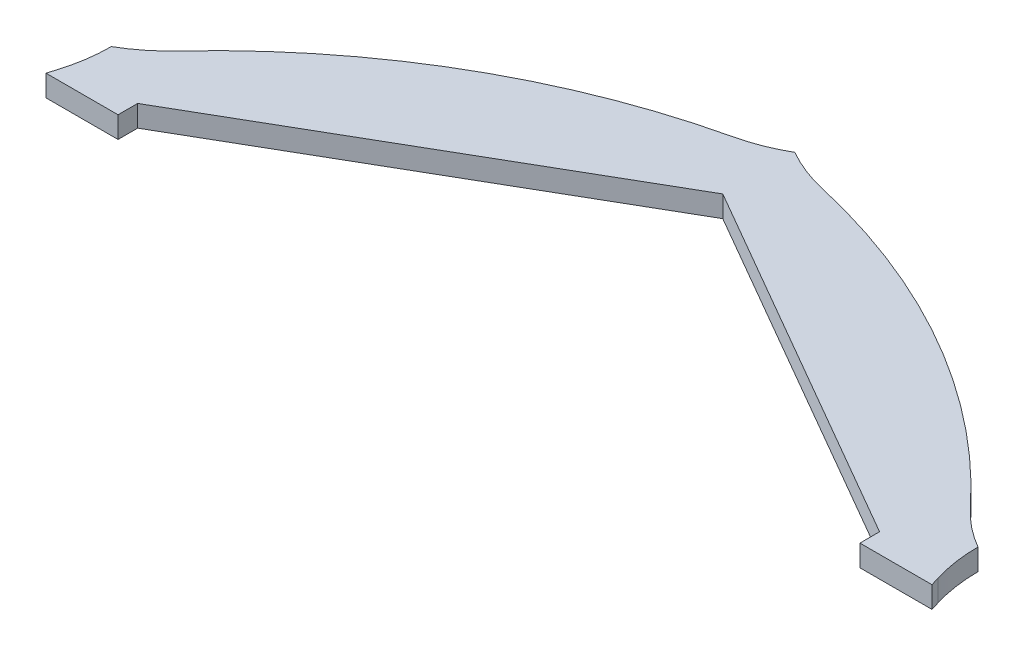
ISO-10303-21;
HEADER;
FILE_DESCRIPTION(('STEP AP214'),'2;1');
FILE_NAME('part.step','',(''),(''),'','','');
FILE_SCHEMA(('AUTOMOTIVE_DESIGN { 1 0 10303 214 1 1 1 1 }'));
ENDSEC;
DATA;
#1=APPLICATION_CONTEXT('core data for automotive mechanical design processes');
#2=APPLICATION_PROTOCOL_DEFINITION('international standard','automotive_design',2000,#1);
#3=PRODUCT_CONTEXT('',#1,'mechanical');
#4=PRODUCT('Part','Part','',(#3));
#5=PRODUCT_RELATED_PRODUCT_CATEGORY('part','',(#4));
#6=PRODUCT_DEFINITION_FORMATION('','',#4);
#7=PRODUCT_DEFINITION_CONTEXT('part definition',#1,'design');
#8=PRODUCT_DEFINITION('design','',#6,#7);
#9=PRODUCT_DEFINITION_SHAPE('','',#8);
#10=(LENGTH_UNIT() NAMED_UNIT(*) SI_UNIT(.MILLI.,.METRE.));
#11=(NAMED_UNIT(*) PLANE_ANGLE_UNIT() SI_UNIT($,.RADIAN.));
#12=(NAMED_UNIT(*) SI_UNIT($,.STERADIAN.) SOLID_ANGLE_UNIT());
#13=UNCERTAINTY_MEASURE_WITH_UNIT(LENGTH_MEASURE(1.E-05),#10,'distance_accuracy_value','');
#14=(GEOMETRIC_REPRESENTATION_CONTEXT(3) GLOBAL_UNCERTAINTY_ASSIGNED_CONTEXT((#13)) GLOBAL_UNIT_ASSIGNED_CONTEXT((#10,
#11,#12)) REPRESENTATION_CONTEXT('',''));
#15=CARTESIAN_POINT('',(0.,0.,0.));
#16=DIRECTION('',(0.,0.,1.));
#17=DIRECTION('',(1.,0.,0.));
#18=AXIS2_PLACEMENT_3D('',#15,#16,#17);
#19=CARTESIAN_POINT('',(-71.9715242270662,15.,-27.25));
#20=DIRECTION('',(0.,-1.,0.));
#21=DIRECTION('',(0.,0.,-1.));
#22=AXIS2_PLACEMENT_3D('',#19,#20,#21);
#23=PLANE('',#22);
#24=DIRECTION('',(0.,0.,-1.));
#25=VECTOR('',#24,1.);
#26=CARTESIAN_POINT('',(-51.9615242270664,15.,-29.9999999999999));
#27=LINE('',#26,#25);
#28=CARTESIAN_POINT('',(-51.9615242270664,15.,-27.25));
#29=VERTEX_POINT('',#28);
#30=CARTESIAN_POINT('',(-51.9615242270664,15.,-29.9999999999999));
#31=VERTEX_POINT('',#30);
#32=EDGE_CURVE('E275',#29,#31,#27,.T.);
#33=ORIENTED_EDGE('',*,*,#32,.T.);
#34=DIRECTION('',(0.866025403784439,0.,-0.5));
#35=VECTOR('',#34,1.);
#36=CARTESIAN_POINT('',(0.,15.,-59.9999999999999));
#37=LINE('',#36,#35);
#38=CARTESIAN_POINT('',(0.,15.,-59.9999999999999));
#39=VERTEX_POINT('',#38);
#40=EDGE_CURVE('E278',#31,#39,#37,.T.);
#41=ORIENTED_EDGE('',*,*,#40,.T.);
#42=DIRECTION('',(0.866025403784438,0.,0.500000000000001));
#43=VECTOR('',#42,1.);
#44=CARTESIAN_POINT('',(51.9615242270662,15.,-29.9999999999998));
#45=LINE('',#44,#43);
#46=CARTESIAN_POINT('',(51.9615242270662,15.,-29.9999999999998));
#47=VERTEX_POINT('',#46);
#48=EDGE_CURVE('E281',#39,#47,#45,.T.);
#49=ORIENTED_EDGE('',*,*,#48,.T.);
#50=DIRECTION('',(0.,0.,1.));
#51=VECTOR('',#50,1.);
#52=CARTESIAN_POINT('',(51.9615242270664,15.,29.9999999999998));
#53=LINE('',#52,#51);
#54=CARTESIAN_POINT('',(51.9615242270662,15.,-27.25));
#55=VERTEX_POINT('',#54);
#56=EDGE_CURVE('E284',#47,#55,#53,.T.);
#57=ORIENTED_EDGE('',*,*,#56,.T.);
#58=DIRECTION('',(1.,0.,0.));
#59=VECTOR('',#58,1.);
#60=CARTESIAN_POINT('',(-113.272742430532,15.,-27.25));
#61=LINE('',#60,#59);
#62=CARTESIAN_POINT('',(62.0513387849669,15.,-27.25));
#63=VERTEX_POINT('',#62);
#64=EDGE_CURVE('E179',#55,#63,#61,.T.);
#65=ORIENTED_EDGE('',*,*,#64,.T.);
#66=CARTESIAN_POINT('',(-30.9459065602488,15.,0.));
#67=DIRECTION('',(0.,-1.,0.));
#68=DIRECTION('',(0.,0.,-1.));
#69=AXIS2_PLACEMENT_3D('',#66,#67,#68);
#70=CIRCLE('',#69,96.907430787315);
#71=CARTESIAN_POINT('',(61.6946190390512,15.,-28.4391131803312));
#72=VERTEX_POINT('',#71);
#73=EDGE_CURVE('E47',#63,#72,#70,.F.);
#74=ORIENTED_EDGE('',*,*,#73,.T.);
#75=CARTESIAN_POINT('',(83.219854476264,15.,-35.0470053837923));
#76=DIRECTION('',(0.,-1.,0.));
#77=DIRECTION('',(0.,0.,-1.));
#78=AXIS2_PLACEMENT_3D('',#75,#76,#77);
#79=CIRCLE('',#78,22.5166604983954);
#80=CARTESIAN_POINT('',(60.7031939778686,15.,-35.0470053837923));
#81=VERTEX_POINT('',#80);
#82=EDGE_CURVE('E175',#72,#81,#79,.T.);
#83=ORIENTED_EDGE('',*,*,#82,.T.);
#84=CARTESIAN_POINT('',(71.9615242270663,15.,-54.5470053837923));
#85=DIRECTION('',(0.,-1.,0.));
#86=DIRECTION('',(0.,0.,-1.));
#87=AXIS2_PLACEMENT_3D('',#84,#85,#86);
#88=CIRCLE('',#87,22.5166604983954);
#89=CARTESIAN_POINT('',(55.4763039947933,15.,-39.2095507744558));
#90=VERTEX_POINT('',#89);
#91=EDGE_CURVE('E257',#81,#90,#88,.T.);
#92=ORIENTED_EDGE('',*,*,#91,.T.);
#93=CARTESIAN_POINT('',(-15.4729532801244,15.,26.799941224315));
#94=DIRECTION('',(0.,-1.,0.));
#95=DIRECTION('',(0.,0.,-1.));
#96=AXIS2_PLACEMENT_3D('',#93,#94,#95);
#97=CIRCLE('',#96,96.907430787315);
#98=CARTESIAN_POINT('',(6.21831504425794,15.,-67.6486639547871));
#99=VERTEX_POINT('',#98);
#100=EDGE_CURVE('E260',#90,#99,#97,.F.);
#101=ORIENTED_EDGE('',*,*,#100,.T.);
#102=CARTESIAN_POINT('',(11.2583302491977,15.,-89.5940107675849));
#103=DIRECTION('',(0.,-1.,0.));
#104=DIRECTION('',(0.,0.,-1.));
#105=AXIS2_PLACEMENT_3D('',#102,#103,#104);
#106=CIRCLE('',#105,22.5166604983954);
#107=CARTESIAN_POINT('',(0.,15.,-70.0940107675849));
#108=VERTEX_POINT('',#107);
#109=EDGE_CURVE('E263',#99,#108,#106,.T.);
#110=ORIENTED_EDGE('',*,*,#109,.T.);
#111=CARTESIAN_POINT('',(-11.2583302491977,15.,-89.5940107675849));
#112=DIRECTION('',(0.,-1.,0.));
#113=DIRECTION('',(0.,0.,-1.));
#114=AXIS2_PLACEMENT_3D('',#111,#112,#113);
#115=CIRCLE('',#114,22.5166604983954);
#116=CARTESIAN_POINT('',(-6.21831504425794,15.,-67.6486639547871));
#117=VERTEX_POINT('',#116);
#118=EDGE_CURVE('E266',#108,#117,#115,.T.);
#119=ORIENTED_EDGE('',*,*,#118,.T.);
#120=CARTESIAN_POINT('',(15.4729532801244,15.,26.799941224315));
#121=DIRECTION('',(0.,-1.,0.));
#122=DIRECTION('',(0.,0.,-1.));
#123=AXIS2_PLACEMENT_3D('',#120,#121,#122);
#124=CIRCLE('',#123,96.907430787315);
#125=CARTESIAN_POINT('',(-55.4763039947934,15.,-39.2095507744558));
#126=VERTEX_POINT('',#125);
#127=EDGE_CURVE('E269',#117,#126,#124,.F.);
#128=ORIENTED_EDGE('',*,*,#127,.T.);
#129=CARTESIAN_POINT('',(-71.9615242270656,15.,-54.5470053837933));
#130=DIRECTION('',(0.,-1.,0.));
#131=DIRECTION('',(0.,0.,-1.));
#132=AXIS2_PLACEMENT_3D('',#129,#130,#131);
#133=CIRCLE('',#132,22.5166604983955);
#134=CARTESIAN_POINT('',(-60.7031939778681,15.,-35.0470053837931));
#135=VERTEX_POINT('',#134);
#136=EDGE_CURVE('E272',#126,#135,#133,.T.);
#137=ORIENTED_EDGE('',*,*,#136,.T.);
#138=CARTESIAN_POINT('',(-83.2198544762635,15.,-35.0470053837934));
#139=DIRECTION('',(0.,-1.,0.));
#140=DIRECTION('',(0.,0.,-1.));
#141=AXIS2_PLACEMENT_3D('',#138,#139,#140);
#142=CIRCLE('',#141,22.5166604983953);
#143=CARTESIAN_POINT('',(-61.6946190390513,15.,-28.4391131803312));
#144=VERTEX_POINT('',#143);
#145=EDGE_CURVE('E287',#135,#144,#142,.T.);
#146=ORIENTED_EDGE('',*,*,#145,.T.);
#147=CARTESIAN_POINT('',(30.9459065602488,15.,0.));
#148=DIRECTION('',(0.,-1.,0.));
#149=DIRECTION('',(0.,0.,-1.));
#150=AXIS2_PLACEMENT_3D('',#147,#148,#149);
#151=CIRCLE('',#150,96.907430787315);
#152=CARTESIAN_POINT('',(-62.051338784967,15.,-27.25));
#153=VERTEX_POINT('',#152);
#154=EDGE_CURVE('E66',#153,#144,#151,.T.);
#155=ORIENTED_EDGE('',*,*,#154,.F.);
#156=DIRECTION('',(1.,0.,0.));
#157=VECTOR('',#156,1.);
#158=CARTESIAN_POINT('',(-113.272742430532,15.,-27.25));
#159=LINE('',#158,#157);
#160=EDGE_CURVE('E59',#153,#29,#159,.T.);
#161=ORIENTED_EDGE('',*,*,#160,.T.);
#162=EDGE_LOOP('',(#33,#41,#49,#57,#65,#74,#83,#92,#101,#110,#119,#128,#137,#146,#155,#161));
#163=FACE_BOUND('',#162,.T.);
#164=ADVANCED_FACE('F43',(#163),#23,.F.);
#165=CARTESIAN_POINT('',(-71.9715242270662,12.,-27.25));
#166=DIRECTION('',(0.,-1.,0.));
#167=DIRECTION('',(0.,0.,-1.));
#168=AXIS2_PLACEMENT_3D('',#165,#166,#167);
#169=PLANE('',#168);
#170=DIRECTION('',(0.,0.,-1.));
#171=VECTOR('',#170,1.);
#172=CARTESIAN_POINT('',(-51.9615242270664,12.,-29.9999999999999));
#173=LINE('',#172,#171);
#174=CARTESIAN_POINT('',(-51.9615242270664,12.,-27.25));
#175=VERTEX_POINT('',#174);
#176=CARTESIAN_POINT('',(-51.9615242270664,12.,-29.9999999999999));
#177=VERTEX_POINT('',#176);
#178=EDGE_CURVE('E165',#175,#177,#173,.T.);
#179=ORIENTED_EDGE('',*,*,#178,.F.);
#180=DIRECTION('',(1.,0.,0.));
#181=VECTOR('',#180,1.);
#182=CARTESIAN_POINT('',(-113.272742430532,12.,-27.25));
#183=LINE('',#182,#181);
#184=CARTESIAN_POINT('',(-62.051338784967,12.,-27.25));
#185=VERTEX_POINT('',#184);
#186=EDGE_CURVE('E157',#185,#175,#183,.T.);
#187=ORIENTED_EDGE('',*,*,#186,.F.);
#188=CARTESIAN_POINT('',(30.9459065602488,12.,0.));
#189=DIRECTION('',(0.,-1.,0.));
#190=DIRECTION('',(0.,0.,-1.));
#191=AXIS2_PLACEMENT_3D('',#188,#189,#190);
#192=CIRCLE('',#191,96.907430787315);
#193=CARTESIAN_POINT('',(-61.6946190390513,12.,-28.4391131803312));
#194=VERTEX_POINT('',#193);
#195=EDGE_CURVE('E163',#185,#194,#192,.T.);
#196=ORIENTED_EDGE('',*,*,#195,.T.);
#197=CARTESIAN_POINT('',(-83.2198544762635,12.,-35.0470053837934));
#198=DIRECTION('',(0.,-1.,0.));
#199=DIRECTION('',(0.,0.,-1.));
#200=AXIS2_PLACEMENT_3D('',#197,#198,#199);
#201=CIRCLE('',#200,22.5166604983953);
#202=CARTESIAN_POINT('',(-60.7031939778681,12.,-35.0470053837931));
#203=VERTEX_POINT('',#202);
#204=EDGE_CURVE('E207',#203,#194,#201,.T.);
#205=ORIENTED_EDGE('',*,*,#204,.F.);
#206=CARTESIAN_POINT('',(-71.9615242270656,12.,-54.5470053837933));
#207=DIRECTION('',(0.,-1.,0.));
#208=DIRECTION('',(0.,0.,-1.));
#209=AXIS2_PLACEMENT_3D('',#206,#207,#208);
#210=CIRCLE('',#209,22.5166604983955);
#211=CARTESIAN_POINT('',(-55.4763039947934,12.,-39.2095507744558));
#212=VERTEX_POINT('',#211);
#213=EDGE_CURVE('E195',#212,#203,#210,.T.);
#214=ORIENTED_EDGE('',*,*,#213,.F.);
#215=CARTESIAN_POINT('',(15.4729532801244,12.,26.799941224315));
#216=DIRECTION('',(0.,-1.,0.));
#217=DIRECTION('',(0.,0.,-1.));
#218=AXIS2_PLACEMENT_3D('',#215,#216,#217);
#219=CIRCLE('',#218,96.907430787315);
#220=CARTESIAN_POINT('',(-6.21831504425794,12.,-67.6486639547871));
#221=VERTEX_POINT('',#220);
#222=EDGE_CURVE('E192',#221,#212,#219,.F.);
#223=ORIENTED_EDGE('',*,*,#222,.F.);
#224=CARTESIAN_POINT('',(-11.2583302491977,12.,-89.5940107675849));
#225=DIRECTION('',(0.,-1.,0.));
#226=DIRECTION('',(0.,0.,-1.));
#227=AXIS2_PLACEMENT_3D('',#224,#225,#226);
#228=CIRCLE('',#227,22.5166604983954);
#229=CARTESIAN_POINT('',(0.,12.,-70.0940107675849));
#230=VERTEX_POINT('',#229);
#231=EDGE_CURVE('E189',#230,#221,#228,.T.);
#232=ORIENTED_EDGE('',*,*,#231,.F.);
#233=CARTESIAN_POINT('',(11.2583302491977,12.,-89.5940107675849));
#234=DIRECTION('',(0.,-1.,0.));
#235=DIRECTION('',(0.,0.,-1.));
#236=AXIS2_PLACEMENT_3D('',#233,#234,#235);
#237=CIRCLE('',#236,22.5166604983954);
#238=CARTESIAN_POINT('',(6.21831504425794,12.,-67.6486639547871));
#239=VERTEX_POINT('',#238);
#240=EDGE_CURVE('E186',#239,#230,#237,.T.);
#241=ORIENTED_EDGE('',*,*,#240,.F.);
#242=CARTESIAN_POINT('',(-15.4729532801244,12.,26.799941224315));
#243=DIRECTION('',(0.,-1.,0.));
#244=DIRECTION('',(0.,0.,-1.));
#245=AXIS2_PLACEMENT_3D('',#242,#243,#244);
#246=CIRCLE('',#245,96.907430787315);
#247=CARTESIAN_POINT('',(55.4763039947933,12.,-39.2095507744558));
#248=VERTEX_POINT('',#247);
#249=EDGE_CURVE('E183',#248,#239,#246,.F.);
#250=ORIENTED_EDGE('',*,*,#249,.F.);
#251=CARTESIAN_POINT('',(71.9615242270663,12.,-54.5470053837923));
#252=DIRECTION('',(0.,-1.,0.));
#253=DIRECTION('',(0.,0.,-1.));
#254=AXIS2_PLACEMENT_3D('',#251,#252,#253);
#255=CIRCLE('',#254,22.5166604983954);
#256=CARTESIAN_POINT('',(60.7031939778686,12.,-35.0470053837923));
#257=VERTEX_POINT('',#256);
#258=EDGE_CURVE('E166',#257,#248,#255,.T.);
#259=ORIENTED_EDGE('',*,*,#258,.F.);
#260=CARTESIAN_POINT('',(83.219854476264,12.,-35.0470053837923));
#261=DIRECTION('',(0.,-1.,0.));
#262=DIRECTION('',(0.,0.,-1.));
#263=AXIS2_PLACEMENT_3D('',#260,#261,#262);
#264=CIRCLE('',#263,22.5166604983954);
#265=CARTESIAN_POINT('',(61.6946190390512,12.,-28.4391131803312));
#266=VERTEX_POINT('',#265);
#267=EDGE_CURVE('E209',#266,#257,#264,.T.);
#268=ORIENTED_EDGE('',*,*,#267,.F.);
#269=CARTESIAN_POINT('',(-30.9459065602488,12.,0.));
#270=DIRECTION('',(0.,-1.,0.));
#271=DIRECTION('',(0.,0.,-1.));
#272=AXIS2_PLACEMENT_3D('',#269,#270,#271);
#273=CIRCLE('',#272,96.907430787315);
#274=CARTESIAN_POINT('',(62.0513387849669,12.,-27.25));
#275=VERTEX_POINT('',#274);
#276=EDGE_CURVE('E211',#275,#266,#273,.F.);
#277=ORIENTED_EDGE('',*,*,#276,.F.);
#278=DIRECTION('',(1.,0.,0.));
#279=VECTOR('',#278,1.);
#280=CARTESIAN_POINT('',(-113.272742430532,12.,-27.25));
#281=LINE('',#280,#279);
#282=CARTESIAN_POINT('',(51.9615242270662,12.,-27.25));
#283=VERTEX_POINT('',#282);
#284=EDGE_CURVE('E167',#283,#275,#281,.T.);
#285=ORIENTED_EDGE('',*,*,#284,.F.);
#286=DIRECTION('',(0.,0.,1.));
#287=VECTOR('',#286,1.);
#288=CARTESIAN_POINT('',(51.9615242270664,12.,29.9999999999998));
#289=LINE('',#288,#287);
#290=CARTESIAN_POINT('',(51.9615242270662,12.,-29.9999999999998));
#291=VERTEX_POINT('',#290);
#292=EDGE_CURVE('E205',#291,#283,#289,.T.);
#293=ORIENTED_EDGE('',*,*,#292,.F.);
#294=DIRECTION('',(0.866025403784438,0.,0.500000000000001));
#295=VECTOR('',#294,1.);
#296=CARTESIAN_POINT('',(51.9615242270662,12.,-29.9999999999998));
#297=LINE('',#296,#295);
#298=CARTESIAN_POINT('',(0.,12.,-59.9999999999999));
#299=VERTEX_POINT('',#298);
#300=EDGE_CURVE('E202',#299,#291,#297,.T.);
#301=ORIENTED_EDGE('',*,*,#300,.F.);
#302=DIRECTION('',(0.866025403784439,0.,-0.5));
#303=VECTOR('',#302,1.);
#304=CARTESIAN_POINT('',(0.,12.,-59.9999999999999));
#305=LINE('',#304,#303);
#306=EDGE_CURVE('E199',#177,#299,#305,.T.);
#307=ORIENTED_EDGE('',*,*,#306,.F.);
#308=EDGE_LOOP('',(#179,#187,#196,#205,#214,#223,#232,#241,#250,#259,#268,#277,#285,#293,#301,#307));
#309=FACE_BOUND('',#308,.T.);
#310=ADVANCED_FACE('F162',(#309),#169,.T.);
#311=CARTESIAN_POINT('',(-15.4729532801244,321.635622017633,26.799941224315));
#312=DIRECTION('',(0.,-1.,0.));
#313=DIRECTION('',(0.,0.,-1.));
#314=AXIS2_PLACEMENT_3D('',#311,#312,#313);
#315=CYLINDRICAL_SURFACE('',#314,96.907430787315);
#316=ORIENTED_EDGE('',*,*,#100,.F.);
#317=DIRECTION('',(0.,-1.,0.));
#318=VECTOR('',#317,1.);
#319=CARTESIAN_POINT('',(55.4763039947933,321.635622017633,-39.2095507744558));
#320=LINE('',#319,#318);
#321=EDGE_CURVE('E235',#90,#248,#320,.T.);
#322=ORIENTED_EDGE('',*,*,#321,.T.);
#323=ORIENTED_EDGE('',*,*,#249,.T.);
#324=DIRECTION('',(0.,-1.,0.));
#325=VECTOR('',#324,1.);
#326=CARTESIAN_POINT('',(6.21831504425794,321.635622017633,-67.6486639547871));
#327=LINE('',#326,#325);
#328=EDGE_CURVE('E238',#99,#239,#327,.T.);
#329=ORIENTED_EDGE('',*,*,#328,.F.);
#330=EDGE_LOOP('',(#316,#322,#323,#329));
#331=FACE_BOUND('',#330,.T.);
#332=ADVANCED_FACE('F300',(#331),#315,.T.);
#333=CARTESIAN_POINT('',(11.2583302491977,321.635622017633,-89.5940107675849));
#334=DIRECTION('',(0.,-1.,0.));
#335=DIRECTION('',(0.,0.,-1.));
#336=AXIS2_PLACEMENT_3D('',#333,#334,#335);
#337=CYLINDRICAL_SURFACE('',#336,22.5166604983954);
#338=ORIENTED_EDGE('',*,*,#109,.F.);
#339=ORIENTED_EDGE('',*,*,#328,.T.);
#340=ORIENTED_EDGE('',*,*,#240,.T.);
#341=DIRECTION('',(0.,-1.,0.));
#342=VECTOR('',#341,1.);
#343=CARTESIAN_POINT('',(0.,321.635622017633,-70.0940107675849));
#344=LINE('',#343,#342);
#345=EDGE_CURVE('E241',#108,#230,#344,.T.);
#346=ORIENTED_EDGE('',*,*,#345,.F.);
#347=EDGE_LOOP('',(#338,#339,#340,#346));
#348=FACE_BOUND('',#347,.T.);
#349=ADVANCED_FACE('F305',(#348),#337,.F.);
#350=CARTESIAN_POINT('',(-11.2583302491977,321.635622017633,-89.5940107675849));
#351=DIRECTION('',(0.,-1.,0.));
#352=DIRECTION('',(0.,0.,-1.));
#353=AXIS2_PLACEMENT_3D('',#350,#351,#352);
#354=CYLINDRICAL_SURFACE('',#353,22.5166604983954);
#355=ORIENTED_EDGE('',*,*,#118,.F.);
#356=ORIENTED_EDGE('',*,*,#345,.T.);
#357=ORIENTED_EDGE('',*,*,#231,.T.);
#358=DIRECTION('',(0.,-1.,0.));
#359=VECTOR('',#358,1.);
#360=CARTESIAN_POINT('',(-6.21831504425794,321.635622017633,-67.6486639547871));
#361=LINE('',#360,#359);
#362=EDGE_CURVE('E244',#117,#221,#361,.T.);
#363=ORIENTED_EDGE('',*,*,#362,.F.);
#364=EDGE_LOOP('',(#355,#356,#357,#363));
#365=FACE_BOUND('',#364,.T.);
#366=ADVANCED_FACE('F307',(#365),#354,.F.);
#367=CARTESIAN_POINT('',(15.4729532801244,321.635622017633,26.799941224315));
#368=DIRECTION('',(0.,-1.,0.));
#369=DIRECTION('',(0.,0.,-1.));
#370=AXIS2_PLACEMENT_3D('',#367,#368,#369);
#371=CYLINDRICAL_SURFACE('',#370,96.907430787315);
#372=ORIENTED_EDGE('',*,*,#127,.F.);
#373=ORIENTED_EDGE('',*,*,#362,.T.);
#374=ORIENTED_EDGE('',*,*,#222,.T.);
#375=DIRECTION('',(0.,-1.,0.));
#376=VECTOR('',#375,1.);
#377=CARTESIAN_POINT('',(-55.4763039947934,321.635622017633,-39.2095507744558));
#378=LINE('',#377,#376);
#379=EDGE_CURVE('E247',#126,#212,#378,.T.);
#380=ORIENTED_EDGE('',*,*,#379,.F.);
#381=EDGE_LOOP('',(#372,#373,#374,#380));
#382=FACE_BOUND('',#381,.T.);
#383=ADVANCED_FACE('F309',(#382),#371,.T.);
#384=CARTESIAN_POINT('',(-71.9615242270656,321.635622017633,-54.5470053837933));
#385=DIRECTION('',(0.,-1.,0.));
#386=DIRECTION('',(0.,0.,-1.));
#387=AXIS2_PLACEMENT_3D('',#384,#385,#386);
#388=CYLINDRICAL_SURFACE('',#387,22.5166604983955);
#389=ORIENTED_EDGE('',*,*,#136,.F.);
#390=ORIENTED_EDGE('',*,*,#379,.T.);
#391=ORIENTED_EDGE('',*,*,#213,.T.);
#392=DIRECTION('',(0.,-1.,0.));
#393=VECTOR('',#392,1.);
#394=CARTESIAN_POINT('',(-60.7031939778681,321.635622017633,-35.0470053837931));
#395=LINE('',#394,#393);
#396=EDGE_CURVE('E250',#135,#203,#395,.T.);
#397=ORIENTED_EDGE('',*,*,#396,.F.);
#398=EDGE_LOOP('',(#389,#390,#391,#397));
#399=FACE_BOUND('',#398,.T.);
#400=ADVANCED_FACE('F313',(#399),#388,.F.);
#401=CARTESIAN_POINT('',(-83.2198544762635,321.635622017633,-35.0470053837934));
#402=DIRECTION('',(0.,-1.,0.));
#403=DIRECTION('',(0.,0.,-1.));
#404=AXIS2_PLACEMENT_3D('',#401,#402,#403);
#405=CYLINDRICAL_SURFACE('',#404,22.5166604983953);
#406=ORIENTED_EDGE('',*,*,#145,.F.);
#407=ORIENTED_EDGE('',*,*,#396,.T.);
#408=ORIENTED_EDGE('',*,*,#204,.T.);
#409=DIRECTION('',(0.,-1.,0.));
#410=VECTOR('',#409,1.);
#411=CARTESIAN_POINT('',(-61.6946190390513,321.635622017633,-28.4391131803312));
#412=LINE('',#411,#410);
#413=EDGE_CURVE('E171',#144,#194,#412,.T.);
#414=ORIENTED_EDGE('',*,*,#413,.F.);
#415=EDGE_LOOP('',(#406,#407,#408,#414));
#416=FACE_BOUND('',#415,.T.);
#417=ADVANCED_FACE('F315',(#416),#405,.F.);
#418=CARTESIAN_POINT('',(-113.272742430532,-42.01,-27.25));
#419=DIRECTION('',(0.,0.,1.));
#420=DIRECTION('',(1.,0.,0.));
#421=AXIS2_PLACEMENT_3D('',#418,#419,#420);
#422=PLANE('',#421);
#423=ORIENTED_EDGE('',*,*,#160,.F.);
#424=DIRECTION('',(0.,-1.,0.));
#425=VECTOR('',#424,1.);
#426=CARTESIAN_POINT('',(-62.051338784967,321.635622017633,-27.25));
#427=LINE('',#426,#425);
#428=EDGE_CURVE('E11',#153,#185,#427,.T.);
#429=ORIENTED_EDGE('',*,*,#428,.T.);
#430=ORIENTED_EDGE('',*,*,#186,.T.);
#431=DIRECTION('',(0.,-1.,0.));
#432=VECTOR('',#431,1.);
#433=CARTESIAN_POINT('',(-51.9615242270664,9.,-27.25));
#434=LINE('',#433,#432);
#435=EDGE_CURVE('E52',#29,#175,#434,.T.);
#436=ORIENTED_EDGE('',*,*,#435,.F.);
#437=EDGE_LOOP('',(#423,#429,#430,#436));
#438=FACE_BOUND('',#437,.T.);
#439=ADVANCED_FACE('F156',(#438),#422,.T.);
#440=CARTESIAN_POINT('',(30.9459065602488,321.635622017633,0.));
#441=DIRECTION('',(0.,-1.,0.));
#442=DIRECTION('',(0.,0.,-1.));
#443=AXIS2_PLACEMENT_3D('',#440,#441,#442);
#444=CYLINDRICAL_SURFACE('',#443,96.907430787315);
#445=ORIENTED_EDGE('',*,*,#428,.F.);
#446=ORIENTED_EDGE('',*,*,#154,.T.);
#447=ORIENTED_EDGE('',*,*,#413,.T.);
#448=ORIENTED_EDGE('',*,*,#195,.F.);
#449=EDGE_LOOP('',(#445,#446,#447,#448));
#450=FACE_BOUND('',#449,.T.);
#451=ADVANCED_FACE('F169',(#450),#444,.T.);
#452=CARTESIAN_POINT('',(-51.9615242270664,9.,-29.9999999999999));
#453=DIRECTION('',(1.,0.,0.));
#454=DIRECTION('',(0.,0.,-1.));
#455=AXIS2_PLACEMENT_3D('',#452,#453,#454);
#456=PLANE('',#455);
#457=ORIENTED_EDGE('',*,*,#32,.F.);
#458=ORIENTED_EDGE('',*,*,#435,.T.);
#459=ORIENTED_EDGE('',*,*,#178,.T.);
#460=DIRECTION('',(0.,-1.,0.));
#461=VECTOR('',#460,1.);
#462=CARTESIAN_POINT('',(-51.9615242270664,9.,-29.9999999999999));
#463=LINE('',#462,#461);
#464=EDGE_CURVE('E223',#31,#177,#463,.T.);
#465=ORIENTED_EDGE('',*,*,#464,.F.);
#466=EDGE_LOOP('',(#457,#458,#459,#465));
#467=FACE_BOUND('',#466,.T.);
#468=ADVANCED_FACE('F333',(#467),#456,.T.);
#469=CARTESIAN_POINT('',(0.,9.,-59.9999999999999));
#470=DIRECTION('',(0.499999999999999,0.,0.866025403784439));
#471=DIRECTION('',(0.866025403784439,0.,-0.5));
#472=AXIS2_PLACEMENT_3D('',#469,#470,#471);
#473=PLANE('',#472);
#474=ORIENTED_EDGE('',*,*,#40,.F.);
#475=ORIENTED_EDGE('',*,*,#464,.T.);
#476=ORIENTED_EDGE('',*,*,#306,.T.);
#477=DIRECTION('',(0.,-1.,0.));
#478=VECTOR('',#477,1.);
#479=CARTESIAN_POINT('',(0.,9.,-59.9999999999999));
#480=LINE('',#479,#478);
#481=EDGE_CURVE('E220',#39,#299,#480,.T.);
#482=ORIENTED_EDGE('',*,*,#481,.F.);
#483=EDGE_LOOP('',(#474,#475,#476,#482));
#484=FACE_BOUND('',#483,.T.);
#485=ADVANCED_FACE('F331',(#484),#473,.T.);
#486=CARTESIAN_POINT('',(71.9615242270663,321.635622017633,-54.5470053837923));
#487=DIRECTION('',(0.,-1.,0.));
#488=DIRECTION('',(0.,0.,-1.));
#489=AXIS2_PLACEMENT_3D('',#486,#487,#488);
#490=CYLINDRICAL_SURFACE('',#489,22.5166604983954);
#491=ORIENTED_EDGE('',*,*,#91,.F.);
#492=DIRECTION('',(0.,-1.,0.));
#493=VECTOR('',#492,1.);
#494=CARTESIAN_POINT('',(60.7031939778686,321.635622017633,-35.0470053837923));
#495=LINE('',#494,#493);
#496=EDGE_CURVE('E232',#81,#257,#495,.T.);
#497=ORIENTED_EDGE('',*,*,#496,.T.);
#498=ORIENTED_EDGE('',*,*,#258,.T.);
#499=ORIENTED_EDGE('',*,*,#321,.F.);
#500=EDGE_LOOP('',(#491,#497,#498,#499));
#501=FACE_BOUND('',#500,.T.);
#502=ADVANCED_FACE('F298',(#501),#490,.F.);
#503=CARTESIAN_POINT('',(83.219854476264,321.635622017633,-35.0470053837923));
#504=DIRECTION('',(0.,-1.,0.));
#505=DIRECTION('',(0.,0.,-1.));
#506=AXIS2_PLACEMENT_3D('',#503,#504,#505);
#507=CYLINDRICAL_SURFACE('',#506,22.5166604983954);
#508=ORIENTED_EDGE('',*,*,#82,.F.);
#509=DIRECTION('',(0.,-1.,0.));
#510=VECTOR('',#509,1.);
#511=CARTESIAN_POINT('',(61.6946190390512,321.635622017633,-28.4391131803312));
#512=LINE('',#511,#510);
#513=EDGE_CURVE('E229',#72,#266,#512,.T.);
#514=ORIENTED_EDGE('',*,*,#513,.T.);
#515=ORIENTED_EDGE('',*,*,#267,.T.);
#516=ORIENTED_EDGE('',*,*,#496,.F.);
#517=EDGE_LOOP('',(#508,#514,#515,#516));
#518=FACE_BOUND('',#517,.T.);
#519=ADVANCED_FACE('F294',(#518),#507,.F.);
#520=ORIENTED_EDGE('',*,*,#64,.F.);
#521=DIRECTION('',(0.,1.,0.));
#522=VECTOR('',#521,1.);
#523=CARTESIAN_POINT('',(51.9615242270662,9.,-27.25));
#524=LINE('',#523,#522);
#525=EDGE_CURVE('E214',#283,#55,#524,.T.);
#526=ORIENTED_EDGE('',*,*,#525,.F.);
#527=ORIENTED_EDGE('',*,*,#284,.T.);
#528=DIRECTION('',(0.,-1.,0.));
#529=VECTOR('',#528,1.);
#530=CARTESIAN_POINT('',(62.0513387849669,321.635622017633,-27.25));
#531=LINE('',#530,#529);
#532=EDGE_CURVE('E217',#63,#275,#531,.T.);
#533=ORIENTED_EDGE('',*,*,#532,.F.);
#534=EDGE_LOOP('',(#520,#526,#527,#533));
#535=FACE_BOUND('',#534,.T.);
#536=ADVANCED_FACE('F321',(#535),#422,.T.);
#537=CARTESIAN_POINT('',(-30.9459065602488,321.635622017633,0.));
#538=DIRECTION('',(0.,-1.,0.));
#539=DIRECTION('',(0.,0.,-1.));
#540=AXIS2_PLACEMENT_3D('',#537,#538,#539);
#541=CYLINDRICAL_SURFACE('',#540,96.907430787315);
#542=ORIENTED_EDGE('',*,*,#73,.F.);
#543=ORIENTED_EDGE('',*,*,#532,.T.);
#544=ORIENTED_EDGE('',*,*,#276,.T.);
#545=ORIENTED_EDGE('',*,*,#513,.F.);
#546=EDGE_LOOP('',(#542,#543,#544,#545));
#547=FACE_BOUND('',#546,.T.);
#548=ADVANCED_FACE('F318',(#547),#541,.T.);
#549=CARTESIAN_POINT('',(51.9615242270662,9.,-29.9999999999998));
#550=DIRECTION('',(-0.500000000000001,0.,0.866025403784438));
#551=DIRECTION('',(0.866025403784438,0.,0.500000000000001));
#552=AXIS2_PLACEMENT_3D('',#549,#550,#551);
#553=PLANE('',#552);
#554=ORIENTED_EDGE('',*,*,#48,.F.);
#555=ORIENTED_EDGE('',*,*,#481,.T.);
#556=ORIENTED_EDGE('',*,*,#300,.T.);
#557=DIRECTION('',(0.,-1.,0.));
#558=VECTOR('',#557,1.);
#559=CARTESIAN_POINT('',(51.9615242270662,9.,-29.9999999999998));
#560=LINE('',#559,#558);
#561=EDGE_CURVE('E226',#47,#291,#560,.T.);
#562=ORIENTED_EDGE('',*,*,#561,.F.);
#563=EDGE_LOOP('',(#554,#555,#556,#562));
#564=FACE_BOUND('',#563,.T.);
#565=ADVANCED_FACE('F326',(#564),#553,.T.);
#566=CARTESIAN_POINT('',(51.9615242270664,9.,29.9999999999998));
#567=DIRECTION('',(-1.,0.,0.));
#568=DIRECTION('',(0.,0.,1.));
#569=AXIS2_PLACEMENT_3D('',#566,#567,#568);
#570=PLANE('',#569);
#571=ORIENTED_EDGE('',*,*,#56,.F.);
#572=ORIENTED_EDGE('',*,*,#561,.T.);
#573=ORIENTED_EDGE('',*,*,#292,.T.);
#574=ORIENTED_EDGE('',*,*,#525,.T.);
#575=EDGE_LOOP('',(#571,#572,#573,#574));
#576=FACE_BOUND('',#575,.T.);
#577=ADVANCED_FACE('F45',(#576),#570,.T.);
#578=CLOSED_SHELL('',(#164,#310,#332,#349,#366,#383,#400,#417,#439,#451,#468,#485,#502,#519,
#536,#548,#565,#577));
#579=MANIFOLD_SOLID_BREP('B2',#578);
#580=ADVANCED_BREP_SHAPE_REPRESENTATION('',(#18,#579),#14);
#581=SHAPE_DEFINITION_REPRESENTATION(#9,#580);
ENDSEC;
END-ISO-10303-21;
